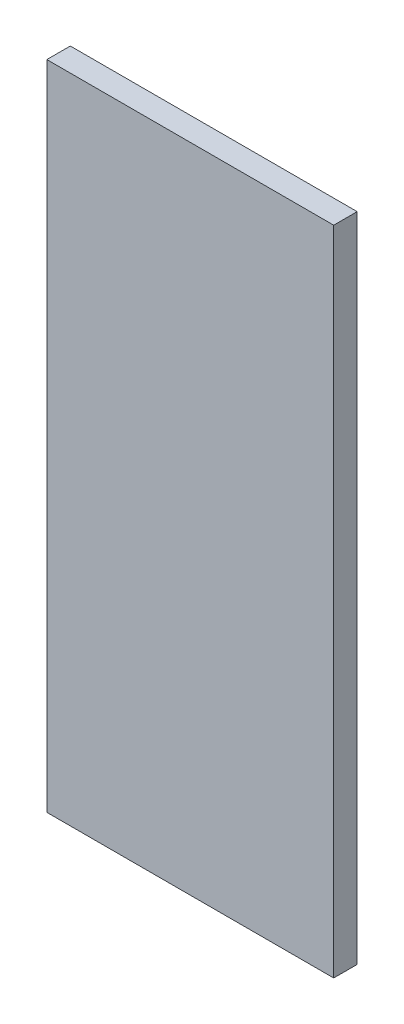
ISO-10303-21;
HEADER;
FILE_DESCRIPTION(('STEP AP214'),'2;1');
FILE_NAME('part.step','',(''),(''),'','','');
FILE_SCHEMA(('AUTOMOTIVE_DESIGN { 1 0 10303 214 1 1 1 1 }'));
ENDSEC;
DATA;
#1=APPLICATION_CONTEXT('core data for automotive mechanical design processes');
#2=APPLICATION_PROTOCOL_DEFINITION('international standard','automotive_design',2000,#1);
#3=PRODUCT_CONTEXT('',#1,'mechanical');
#4=PRODUCT('Part','Part','',(#3));
#5=PRODUCT_RELATED_PRODUCT_CATEGORY('part','',(#4));
#6=PRODUCT_DEFINITION_FORMATION('','',#4);
#7=PRODUCT_DEFINITION_CONTEXT('part definition',#1,'design');
#8=PRODUCT_DEFINITION('design','',#6,#7);
#9=PRODUCT_DEFINITION_SHAPE('','',#8);
#10=(LENGTH_UNIT() NAMED_UNIT(*) SI_UNIT(.MILLI.,.METRE.));
#11=(NAMED_UNIT(*) PLANE_ANGLE_UNIT() SI_UNIT($,.RADIAN.));
#12=(NAMED_UNIT(*) SI_UNIT($,.STERADIAN.) SOLID_ANGLE_UNIT());
#13=UNCERTAINTY_MEASURE_WITH_UNIT(LENGTH_MEASURE(1.E-05),#10,'distance_accuracy_value','');
#14=(GEOMETRIC_REPRESENTATION_CONTEXT(3) GLOBAL_UNCERTAINTY_ASSIGNED_CONTEXT((#13)) GLOBAL_UNIT_ASSIGNED_CONTEXT((#10,
#11,#12)) REPRESENTATION_CONTEXT('',''));
#15=CARTESIAN_POINT('',(0.,0.,0.));
#16=DIRECTION('',(0.,0.,1.));
#17=DIRECTION('',(1.,0.,0.));
#18=AXIS2_PLACEMENT_3D('',#15,#16,#17);
#19=CARTESIAN_POINT('',(110.,-250.,18.));
#20=DIRECTION('',(-1.,0.,0.));
#21=DIRECTION('',(0.,0.,1.));
#22=AXIS2_PLACEMENT_3D('',#19,#20,#21);
#23=PLANE('',#22);
#24=DIRECTION('',(0.,1.,0.));
#25=VECTOR('',#24,1.);
#26=CARTESIAN_POINT('',(110.,-250.,0.));
#27=LINE('',#26,#25);
#28=CARTESIAN_POINT('',(110.,-250.,0.));
#29=VERTEX_POINT('',#28);
#30=CARTESIAN_POINT('',(110.,250.,0.));
#31=VERTEX_POINT('',#30);
#32=EDGE_CURVE('E96',#29,#31,#27,.T.);
#33=ORIENTED_EDGE('',*,*,#32,.T.);
#34=DIRECTION('',(0.,0.,-1.));
#35=VECTOR('',#34,1.);
#36=CARTESIAN_POINT('',(110.,250.,18.));
#37=LINE('',#36,#35);
#38=CARTESIAN_POINT('',(110.,250.,18.));
#39=VERTEX_POINT('',#38);
#40=EDGE_CURVE('E11',#39,#31,#37,.T.);
#41=ORIENTED_EDGE('',*,*,#40,.F.);
#42=DIRECTION('',(0.,1.,0.));
#43=VECTOR('',#42,1.);
#44=CARTESIAN_POINT('',(110.,-250.,18.));
#45=LINE('',#44,#43);
#46=CARTESIAN_POINT('',(110.,-250.,18.));
#47=VERTEX_POINT('',#46);
#48=EDGE_CURVE('E84',#47,#39,#45,.T.);
#49=ORIENTED_EDGE('',*,*,#48,.F.);
#50=DIRECTION('',(0.,0.,-1.));
#51=VECTOR('',#50,1.);
#52=CARTESIAN_POINT('',(110.,-250.,18.));
#53=LINE('',#52,#51);
#54=EDGE_CURVE('E92',#47,#29,#53,.T.);
#55=ORIENTED_EDGE('',*,*,#54,.T.);
#56=EDGE_LOOP('',(#33,#41,#49,#55));
#57=FACE_BOUND('',#56,.T.);
#58=ADVANCED_FACE('F33',(#57),#23,.F.);
#59=CARTESIAN_POINT('',(-110.,250.,18.));
#60=DIRECTION('',(0.,-1.,0.));
#61=DIRECTION('',(0.,0.,-1.));
#62=AXIS2_PLACEMENT_3D('',#59,#60,#61);
#63=PLANE('',#62);
#64=DIRECTION('',(-1.,0.,0.));
#65=VECTOR('',#64,1.);
#66=CARTESIAN_POINT('',(-110.,250.,0.));
#67=LINE('',#66,#65);
#68=CARTESIAN_POINT('',(-110.,250.,0.));
#69=VERTEX_POINT('',#68);
#70=EDGE_CURVE('E88',#31,#69,#67,.T.);
#71=ORIENTED_EDGE('',*,*,#70,.T.);
#72=DIRECTION('',(0.,0.,-1.));
#73=VECTOR('',#72,1.);
#74=CARTESIAN_POINT('',(-110.,250.,18.));
#75=LINE('',#74,#73);
#76=CARTESIAN_POINT('',(-110.,250.,18.));
#77=VERTEX_POINT('',#76);
#78=EDGE_CURVE('E41',#77,#69,#75,.T.);
#79=ORIENTED_EDGE('',*,*,#78,.F.);
#80=DIRECTION('',(-1.,0.,0.));
#81=VECTOR('',#80,1.);
#82=CARTESIAN_POINT('',(-110.,250.,18.));
#83=LINE('',#82,#81);
#84=EDGE_CURVE('E79',#39,#77,#83,.T.);
#85=ORIENTED_EDGE('',*,*,#84,.F.);
#86=ORIENTED_EDGE('',*,*,#40,.T.);
#87=EDGE_LOOP('',(#71,#79,#85,#86));
#88=FACE_BOUND('',#87,.T.);
#89=ADVANCED_FACE('F87',(#88),#63,.F.);
#90=CARTESIAN_POINT('',(-110.,-250.,18.));
#91=DIRECTION('',(1.,0.,0.));
#92=DIRECTION('',(0.,0.,-1.));
#93=AXIS2_PLACEMENT_3D('',#90,#91,#92);
#94=PLANE('',#93);
#95=DIRECTION('',(0.,-1.,0.));
#96=VECTOR('',#95,1.);
#97=CARTESIAN_POINT('',(-110.,-250.,0.));
#98=LINE('',#97,#96);
#99=CARTESIAN_POINT('',(-110.,-250.,0.));
#100=VERTEX_POINT('',#99);
#101=EDGE_CURVE('E66',#69,#100,#98,.T.);
#102=ORIENTED_EDGE('',*,*,#101,.T.);
#103=DIRECTION('',(0.,0.,-1.));
#104=VECTOR('',#103,1.);
#105=CARTESIAN_POINT('',(-110.,-250.,18.));
#106=LINE('',#105,#104);
#107=CARTESIAN_POINT('',(-110.,-250.,18.));
#108=VERTEX_POINT('',#107);
#109=EDGE_CURVE('E89',#108,#100,#106,.T.);
#110=ORIENTED_EDGE('',*,*,#109,.F.);
#111=DIRECTION('',(0.,-1.,0.));
#112=VECTOR('',#111,1.);
#113=CARTESIAN_POINT('',(-110.,-250.,18.));
#114=LINE('',#113,#112);
#115=EDGE_CURVE('E82',#77,#108,#114,.T.);
#116=ORIENTED_EDGE('',*,*,#115,.F.);
#117=ORIENTED_EDGE('',*,*,#78,.T.);
#118=EDGE_LOOP('',(#102,#110,#116,#117));
#119=FACE_BOUND('',#118,.T.);
#120=ADVANCED_FACE('F90',(#119),#94,.F.);
#121=CARTESIAN_POINT('',(-110.,-250.,18.));
#122=DIRECTION('',(0.,1.,0.));
#123=DIRECTION('',(0.,0.,1.));
#124=AXIS2_PLACEMENT_3D('',#121,#122,#123);
#125=PLANE('',#124);
#126=DIRECTION('',(1.,0.,0.));
#127=VECTOR('',#126,1.);
#128=CARTESIAN_POINT('',(-110.,-250.,0.));
#129=LINE('',#128,#127);
#130=EDGE_CURVE('E72',#100,#29,#129,.T.);
#131=ORIENTED_EDGE('',*,*,#130,.T.);
#132=ORIENTED_EDGE('',*,*,#54,.F.);
#133=DIRECTION('',(1.,0.,0.));
#134=VECTOR('',#133,1.);
#135=CARTESIAN_POINT('',(-110.,-250.,18.));
#136=LINE('',#135,#134);
#137=EDGE_CURVE('E49',#108,#47,#136,.T.);
#138=ORIENTED_EDGE('',*,*,#137,.F.);
#139=ORIENTED_EDGE('',*,*,#109,.T.);
#140=EDGE_LOOP('',(#131,#132,#138,#139));
#141=FACE_BOUND('',#140,.T.);
#142=ADVANCED_FACE('F103',(#141),#125,.F.);
#143=CARTESIAN_POINT('',(0.,0.,18.));
#144=DIRECTION('',(0.,0.,-1.));
#145=DIRECTION('',(-1.,0.,0.));
#146=AXIS2_PLACEMENT_3D('',#143,#144,#145);
#147=PLANE('',#146);
#148=ORIENTED_EDGE('',*,*,#48,.T.);
#149=ORIENTED_EDGE('',*,*,#84,.T.);
#150=ORIENTED_EDGE('',*,*,#115,.T.);
#151=ORIENTED_EDGE('',*,*,#137,.T.);
#152=EDGE_LOOP('',(#148,#149,#150,#151));
#153=FACE_BOUND('',#152,.T.);
#154=ADVANCED_FACE('F80',(#153),#147,.F.);
#155=CARTESIAN_POINT('',(0.,0.,0.));
#156=DIRECTION('',(0.,0.,-1.));
#157=DIRECTION('',(-1.,0.,0.));
#158=AXIS2_PLACEMENT_3D('',#155,#156,#157);
#159=PLANE('',#158);
#160=ORIENTED_EDGE('',*,*,#32,.F.);
#161=ORIENTED_EDGE('',*,*,#130,.F.);
#162=ORIENTED_EDGE('',*,*,#101,.F.);
#163=ORIENTED_EDGE('',*,*,#70,.F.);
#164=EDGE_LOOP('',(#160,#161,#162,#163));
#165=FACE_BOUND('',#164,.T.);
#166=ADVANCED_FACE('F106',(#165),#159,.T.);
#167=CLOSED_SHELL('',(#58,#89,#120,#142,#154,#166));
#168=MANIFOLD_SOLID_BREP('B2',#167);
#169=ADVANCED_BREP_SHAPE_REPRESENTATION('',(#18,#168),#14);
#170=SHAPE_DEFINITION_REPRESENTATION(#9,#169);
ENDSEC;
END-ISO-10303-21;
